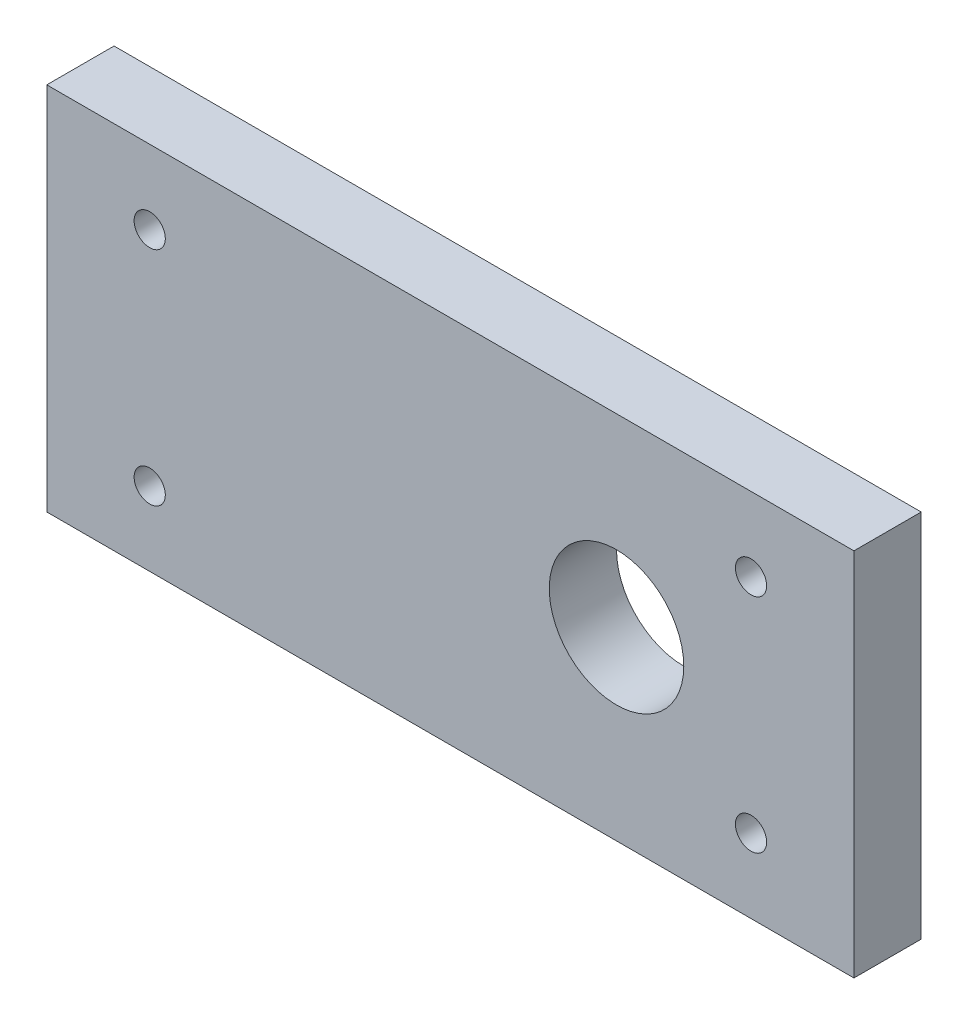
ISO-10303-21;
HEADER;
FILE_DESCRIPTION(('STEP AP214'),'2;1');
FILE_NAME('part.step','',(''),(''),'','','');
FILE_SCHEMA(('AUTOMOTIVE_DESIGN { 1 0 10303 214 1 1 1 1 }'));
ENDSEC;
DATA;
#1=APPLICATION_CONTEXT('core data for automotive mechanical design processes');
#2=APPLICATION_PROTOCOL_DEFINITION('international standard','automotive_design',2000,#1);
#3=PRODUCT_CONTEXT('',#1,'mechanical');
#4=PRODUCT('Part','Part','',(#3));
#5=PRODUCT_RELATED_PRODUCT_CATEGORY('part','',(#4));
#6=PRODUCT_DEFINITION_FORMATION('','',#4);
#7=PRODUCT_DEFINITION_CONTEXT('part definition',#1,'design');
#8=PRODUCT_DEFINITION('design','',#6,#7);
#9=PRODUCT_DEFINITION_SHAPE('','',#8);
#10=(LENGTH_UNIT() NAMED_UNIT(*) SI_UNIT(.MILLI.,.METRE.));
#11=(NAMED_UNIT(*) PLANE_ANGLE_UNIT() SI_UNIT($,.RADIAN.));
#12=(NAMED_UNIT(*) SI_UNIT($,.STERADIAN.) SOLID_ANGLE_UNIT());
#13=UNCERTAINTY_MEASURE_WITH_UNIT(LENGTH_MEASURE(1.E-05),#10,'distance_accuracy_value','');
#14=(GEOMETRIC_REPRESENTATION_CONTEXT(3) GLOBAL_UNCERTAINTY_ASSIGNED_CONTEXT((#13)) GLOBAL_UNIT_ASSIGNED_CONTEXT((#10,
#11,#12)) REPRESENTATION_CONTEXT('',''));
#15=CARTESIAN_POINT('',(0.,0.,0.));
#16=DIRECTION('',(0.,0.,1.));
#17=DIRECTION('',(1.,0.,0.));
#18=AXIS2_PLACEMENT_3D('',#15,#16,#17);
#19=CARTESIAN_POINT('',(0.,0.,6.35));
#20=DIRECTION('',(0.,0.,-1.));
#21=DIRECTION('',(-1.,0.,0.));
#22=AXIS2_PLACEMENT_3D('',#19,#20,#21);
#23=PLANE('',#22);
#24=CARTESIAN_POINT('',(15.6845,0.,6.35));
#25=DIRECTION('',(0.,0.,1.));
#26=DIRECTION('',(1.,0.,0.));
#27=AXIS2_PLACEMENT_3D('',#24,#25,#26);
#28=CIRCLE('',#27,6.35);
#29=CARTESIAN_POINT('',(22.0345,0.,6.35));
#30=VERTEX_POINT('',#29);
#31=EDGE_CURVE('E134',#30,#30,#28,.T.);
#32=ORIENTED_EDGE('',*,*,#31,.F.);
#33=EDGE_LOOP('',(#32));
#34=FACE_BOUND('',#33,.T.);
#35=CARTESIAN_POINT('',(-28.3845,10.4775,6.35));
#36=DIRECTION('',(0.,0.,1.));
#37=DIRECTION('',(1.,0.,0.));
#38=AXIS2_PLACEMENT_3D('',#35,#36,#37);
#39=CIRCLE('',#38,1.4732);
#40=CARTESIAN_POINT('',(-26.9113,10.4775,6.35));
#41=VERTEX_POINT('',#40);
#42=EDGE_CURVE('E128',#41,#41,#39,.T.);
#43=ORIENTED_EDGE('',*,*,#42,.F.);
#44=EDGE_LOOP('',(#43));
#45=FACE_BOUND('',#44,.T.);
#46=CARTESIAN_POINT('',(-28.3845,-10.4775,6.35));
#47=DIRECTION('',(0.,0.,1.));
#48=DIRECTION('',(1.,0.,0.));
#49=AXIS2_PLACEMENT_3D('',#46,#47,#48);
#50=CIRCLE('',#49,1.4732);
#51=CARTESIAN_POINT('',(-26.9113,-10.4775,6.35));
#52=VERTEX_POINT('',#51);
#53=EDGE_CURVE('E122',#52,#52,#50,.T.);
#54=ORIENTED_EDGE('',*,*,#53,.F.);
#55=EDGE_LOOP('',(#54));
#56=FACE_BOUND('',#55,.T.);
#57=CARTESIAN_POINT('',(28.3845,10.4775,6.35));
#58=DIRECTION('',(0.,0.,1.));
#59=DIRECTION('',(1.,0.,0.));
#60=AXIS2_PLACEMENT_3D('',#57,#58,#59);
#61=CIRCLE('',#60,1.4732);
#62=CARTESIAN_POINT('',(29.8577,10.4775,6.35));
#63=VERTEX_POINT('',#62);
#64=EDGE_CURVE('E100',#63,#63,#61,.T.);
#65=ORIENTED_EDGE('',*,*,#64,.F.);
#66=EDGE_LOOP('',(#65));
#67=FACE_BOUND('',#66,.T.);
#68=DIRECTION('',(0.,1.,0.));
#69=VECTOR('',#68,1.);
#70=CARTESIAN_POINT('',(38.1,-17.4625,6.35));
#71=LINE('',#70,#69);
#72=CARTESIAN_POINT('',(38.1,-17.4625,6.35));
#73=VERTEX_POINT('',#72);
#74=CARTESIAN_POINT('',(38.1,17.4625,6.35));
#75=VERTEX_POINT('',#74);
#76=EDGE_CURVE('E85',#73,#75,#71,.T.);
#77=ORIENTED_EDGE('',*,*,#76,.T.);
#78=DIRECTION('',(-1.,0.,0.));
#79=VECTOR('',#78,1.);
#80=CARTESIAN_POINT('',(-38.1,17.4625,6.35));
#81=LINE('',#80,#79);
#82=CARTESIAN_POINT('',(-38.1,17.4625,6.35));
#83=VERTEX_POINT('',#82);
#84=EDGE_CURVE('E80',#75,#83,#81,.T.);
#85=ORIENTED_EDGE('',*,*,#84,.T.);
#86=DIRECTION('',(0.,-1.,0.));
#87=VECTOR('',#86,1.);
#88=CARTESIAN_POINT('',(-38.1,-17.4625,6.35));
#89=LINE('',#88,#87);
#90=CARTESIAN_POINT('',(-38.1,-17.4625,6.35));
#91=VERTEX_POINT('',#90);
#92=EDGE_CURVE('E83',#83,#91,#89,.T.);
#93=ORIENTED_EDGE('',*,*,#92,.T.);
#94=DIRECTION('',(1.,0.,0.));
#95=VECTOR('',#94,1.);
#96=CARTESIAN_POINT('',(-38.1,-17.4625,6.35));
#97=LINE('',#96,#95);
#98=EDGE_CURVE('E50',#91,#73,#97,.T.);
#99=ORIENTED_EDGE('',*,*,#98,.T.);
#100=EDGE_LOOP('',(#77,#85,#93,#99));
#101=FACE_BOUND('',#100,.T.);
#102=CARTESIAN_POINT('',(28.3845,-10.4775,6.35));
#103=DIRECTION('',(0.,0.,1.));
#104=DIRECTION('',(1.,0.,0.));
#105=AXIS2_PLACEMENT_3D('',#102,#103,#104);
#106=CIRCLE('',#105,1.4732);
#107=CARTESIAN_POINT('',(29.8577,-10.4775,6.35));
#108=VERTEX_POINT('',#107);
#109=EDGE_CURVE('E116',#108,#108,#106,.T.);
#110=ORIENTED_EDGE('',*,*,#109,.F.);
#111=EDGE_LOOP('',(#110));
#112=FACE_BOUND('',#111,.T.);
#113=ADVANCED_FACE('F33',(#34,#45,#56,#67,#101,#112),#23,.F.);
#114=CARTESIAN_POINT('',(38.1,-17.4625,6.35));
#115=DIRECTION('',(-1.,0.,0.));
#116=DIRECTION('',(0.,0.,1.));
#117=AXIS2_PLACEMENT_3D('',#114,#115,#116);
#118=PLANE('',#117);
#119=DIRECTION('',(0.,1.,0.));
#120=VECTOR('',#119,1.);
#121=CARTESIAN_POINT('',(38.1,-17.4625,0.));
#122=LINE('',#121,#120);
#123=CARTESIAN_POINT('',(38.1,-17.4625,0.));
#124=VERTEX_POINT('',#123);
#125=CARTESIAN_POINT('',(38.1,17.4625,0.));
#126=VERTEX_POINT('',#125);
#127=EDGE_CURVE('E97',#124,#126,#122,.T.);
#128=ORIENTED_EDGE('',*,*,#127,.T.);
#129=DIRECTION('',(0.,0.,-1.));
#130=VECTOR('',#129,1.);
#131=CARTESIAN_POINT('',(38.1,17.4625,6.35));
#132=LINE('',#131,#130);
#133=EDGE_CURVE('E11',#75,#126,#132,.T.);
#134=ORIENTED_EDGE('',*,*,#133,.F.);
#135=ORIENTED_EDGE('',*,*,#76,.F.);
#136=DIRECTION('',(0.,0.,-1.));
#137=VECTOR('',#136,1.);
#138=CARTESIAN_POINT('',(38.1,-17.4625,6.35));
#139=LINE('',#138,#137);
#140=EDGE_CURVE('E93',#73,#124,#139,.T.);
#141=ORIENTED_EDGE('',*,*,#140,.T.);
#142=EDGE_LOOP('',(#128,#134,#135,#141));
#143=FACE_BOUND('',#142,.T.);
#144=ADVANCED_FACE('F35',(#143),#118,.F.);
#145=CARTESIAN_POINT('',(-38.1,17.4625,6.35));
#146=DIRECTION('',(0.,-1.,0.));
#147=DIRECTION('',(0.,0.,-1.));
#148=AXIS2_PLACEMENT_3D('',#145,#146,#147);
#149=PLANE('',#148);
#150=DIRECTION('',(-1.,0.,0.));
#151=VECTOR('',#150,1.);
#152=CARTESIAN_POINT('',(-38.1,17.4625,0.));
#153=LINE('',#152,#151);
#154=CARTESIAN_POINT('',(-38.1,17.4625,0.));
#155=VERTEX_POINT('',#154);
#156=EDGE_CURVE('E89',#126,#155,#153,.T.);
#157=ORIENTED_EDGE('',*,*,#156,.T.);
#158=DIRECTION('',(0.,0.,-1.));
#159=VECTOR('',#158,1.);
#160=CARTESIAN_POINT('',(-38.1,17.4625,6.35));
#161=LINE('',#160,#159);
#162=EDGE_CURVE('E42',#83,#155,#161,.T.);
#163=ORIENTED_EDGE('',*,*,#162,.F.);
#164=ORIENTED_EDGE('',*,*,#84,.F.);
#165=ORIENTED_EDGE('',*,*,#133,.T.);
#166=EDGE_LOOP('',(#157,#163,#164,#165));
#167=FACE_BOUND('',#166,.T.);
#168=ADVANCED_FACE('F88',(#167),#149,.F.);
#169=CARTESIAN_POINT('',(-38.1,-17.4625,6.35));
#170=DIRECTION('',(1.,0.,0.));
#171=DIRECTION('',(0.,0.,-1.));
#172=AXIS2_PLACEMENT_3D('',#169,#170,#171);
#173=PLANE('',#172);
#174=DIRECTION('',(0.,-1.,0.));
#175=VECTOR('',#174,1.);
#176=CARTESIAN_POINT('',(-38.1,-17.4625,0.));
#177=LINE('',#176,#175);
#178=CARTESIAN_POINT('',(-38.1,-17.4625,0.));
#179=VERTEX_POINT('',#178);
#180=EDGE_CURVE('E67',#155,#179,#177,.T.);
#181=ORIENTED_EDGE('',*,*,#180,.T.);
#182=DIRECTION('',(0.,0.,-1.));
#183=VECTOR('',#182,1.);
#184=CARTESIAN_POINT('',(-38.1,-17.4625,6.35));
#185=LINE('',#184,#183);
#186=EDGE_CURVE('E90',#91,#179,#185,.T.);
#187=ORIENTED_EDGE('',*,*,#186,.F.);
#188=ORIENTED_EDGE('',*,*,#92,.F.);
#189=ORIENTED_EDGE('',*,*,#162,.T.);
#190=EDGE_LOOP('',(#181,#187,#188,#189));
#191=FACE_BOUND('',#190,.T.);
#192=ADVANCED_FACE('F91',(#191),#173,.F.);
#193=CARTESIAN_POINT('',(-38.1,-17.4625,6.35));
#194=DIRECTION('',(0.,1.,0.));
#195=DIRECTION('',(0.,0.,1.));
#196=AXIS2_PLACEMENT_3D('',#193,#194,#195);
#197=PLANE('',#196);
#198=DIRECTION('',(1.,0.,0.));
#199=VECTOR('',#198,1.);
#200=CARTESIAN_POINT('',(-38.1,-17.4625,0.));
#201=LINE('',#200,#199);
#202=EDGE_CURVE('E73',#179,#124,#201,.T.);
#203=ORIENTED_EDGE('',*,*,#202,.T.);
#204=ORIENTED_EDGE('',*,*,#140,.F.);
#205=ORIENTED_EDGE('',*,*,#98,.F.);
#206=ORIENTED_EDGE('',*,*,#186,.T.);
#207=EDGE_LOOP('',(#203,#204,#205,#206));
#208=FACE_BOUND('',#207,.T.);
#209=ADVANCED_FACE('F105',(#208),#197,.F.);
#210=CARTESIAN_POINT('',(0.,0.,0.));
#211=DIRECTION('',(0.,0.,-1.));
#212=DIRECTION('',(-1.,0.,0.));
#213=AXIS2_PLACEMENT_3D('',#210,#211,#212);
#214=PLANE('',#213);
#215=CARTESIAN_POINT('',(15.6845,0.,0.));
#216=DIRECTION('',(0.,0.,-1.));
#217=DIRECTION('',(-1.,0.,0.));
#218=AXIS2_PLACEMENT_3D('',#215,#216,#217);
#219=CIRCLE('',#218,6.35);
#220=CARTESIAN_POINT('',(9.3345,0.,0.));
#221=VERTEX_POINT('',#220);
#222=EDGE_CURVE('E135',#221,#221,#219,.F.);
#223=ORIENTED_EDGE('',*,*,#222,.T.);
#224=EDGE_LOOP('',(#223));
#225=FACE_BOUND('',#224,.T.);
#226=CARTESIAN_POINT('',(-28.3845,10.4775,0.));
#227=DIRECTION('',(0.,0.,1.));
#228=DIRECTION('',(1.,0.,0.));
#229=AXIS2_PLACEMENT_3D('',#226,#227,#228);
#230=CIRCLE('',#229,1.4732);
#231=CARTESIAN_POINT('',(-26.9113,10.4775,0.));
#232=VERTEX_POINT('',#231);
#233=EDGE_CURVE('E131',#232,#232,#230,.T.);
#234=ORIENTED_EDGE('',*,*,#233,.T.);
#235=EDGE_LOOP('',(#234));
#236=FACE_BOUND('',#235,.T.);
#237=CARTESIAN_POINT('',(-28.3845,-10.4775,0.));
#238=DIRECTION('',(0.,0.,1.));
#239=DIRECTION('',(1.,0.,0.));
#240=AXIS2_PLACEMENT_3D('',#237,#238,#239);
#241=CIRCLE('',#240,1.4732);
#242=CARTESIAN_POINT('',(-26.9113,-10.4775,0.));
#243=VERTEX_POINT('',#242);
#244=EDGE_CURVE('E125',#243,#243,#241,.T.);
#245=ORIENTED_EDGE('',*,*,#244,.T.);
#246=EDGE_LOOP('',(#245));
#247=FACE_BOUND('',#246,.T.);
#248=CARTESIAN_POINT('',(28.3845,-10.4775,0.));
#249=DIRECTION('',(0.,0.,1.));
#250=DIRECTION('',(1.,0.,0.));
#251=AXIS2_PLACEMENT_3D('',#248,#249,#250);
#252=CIRCLE('',#251,1.4732);
#253=CARTESIAN_POINT('',(29.8577,-10.4775,0.));
#254=VERTEX_POINT('',#253);
#255=EDGE_CURVE('E119',#254,#254,#252,.T.);
#256=ORIENTED_EDGE('',*,*,#255,.T.);
#257=EDGE_LOOP('',(#256));
#258=FACE_BOUND('',#257,.T.);
#259=CARTESIAN_POINT('',(28.3845,10.4775,0.));
#260=DIRECTION('',(0.,0.,1.));
#261=DIRECTION('',(1.,0.,0.));
#262=AXIS2_PLACEMENT_3D('',#259,#260,#261);
#263=CIRCLE('',#262,1.4732);
#264=CARTESIAN_POINT('',(29.8577,10.4775,0.));
#265=VERTEX_POINT('',#264);
#266=EDGE_CURVE('E113',#265,#265,#263,.T.);
#267=ORIENTED_EDGE('',*,*,#266,.T.);
#268=EDGE_LOOP('',(#267));
#269=FACE_BOUND('',#268,.T.);
#270=ORIENTED_EDGE('',*,*,#127,.F.);
#271=ORIENTED_EDGE('',*,*,#202,.F.);
#272=ORIENTED_EDGE('',*,*,#180,.F.);
#273=ORIENTED_EDGE('',*,*,#156,.F.);
#274=EDGE_LOOP('',(#270,#271,#272,#273));
#275=FACE_BOUND('',#274,.T.);
#276=ADVANCED_FACE('F108',(#225,#236,#247,#258,#269,#275),#214,.T.);
#277=CARTESIAN_POINT('',(28.3845,10.4775,6.35));
#278=DIRECTION('',(0.,0.,1.));
#279=DIRECTION('',(1.,0.,0.));
#280=AXIS2_PLACEMENT_3D('',#277,#278,#279);
#281=CYLINDRICAL_SURFACE('',#280,1.4732);
#282=ORIENTED_EDGE('',*,*,#266,.F.);
#283=EDGE_LOOP('',(#282));
#284=FACE_BOUND('',#283,.T.);
#285=ORIENTED_EDGE('',*,*,#64,.T.);
#286=EDGE_LOOP('',(#285));
#287=FACE_BOUND('',#286,.T.);
#288=ADVANCED_FACE('F152',(#284,#287),#281,.F.);
#289=CARTESIAN_POINT('',(28.3845,-10.4775,6.35));
#290=DIRECTION('',(0.,0.,1.));
#291=DIRECTION('',(1.,0.,0.));
#292=AXIS2_PLACEMENT_3D('',#289,#290,#291);
#293=CYLINDRICAL_SURFACE('',#292,1.4732);
#294=ORIENTED_EDGE('',*,*,#255,.F.);
#295=EDGE_LOOP('',(#294));
#296=FACE_BOUND('',#295,.T.);
#297=ORIENTED_EDGE('',*,*,#109,.T.);
#298=EDGE_LOOP('',(#297));
#299=FACE_BOUND('',#298,.T.);
#300=ADVANCED_FACE('F154',(#296,#299),#293,.F.);
#301=CARTESIAN_POINT('',(-28.3845,-10.4775,6.35));
#302=DIRECTION('',(0.,0.,1.));
#303=DIRECTION('',(1.,0.,0.));
#304=AXIS2_PLACEMENT_3D('',#301,#302,#303);
#305=CYLINDRICAL_SURFACE('',#304,1.4732);
#306=ORIENTED_EDGE('',*,*,#244,.F.);
#307=EDGE_LOOP('',(#306));
#308=FACE_BOUND('',#307,.T.);
#309=ORIENTED_EDGE('',*,*,#53,.T.);
#310=EDGE_LOOP('',(#309));
#311=FACE_BOUND('',#310,.T.);
#312=ADVANCED_FACE('F161',(#308,#311),#305,.F.);
#313=CARTESIAN_POINT('',(-28.3845,10.4775,6.35));
#314=DIRECTION('',(0.,0.,1.));
#315=DIRECTION('',(1.,0.,0.));
#316=AXIS2_PLACEMENT_3D('',#313,#314,#315);
#317=CYLINDRICAL_SURFACE('',#316,1.4732);
#318=ORIENTED_EDGE('',*,*,#233,.F.);
#319=EDGE_LOOP('',(#318));
#320=FACE_BOUND('',#319,.T.);
#321=ORIENTED_EDGE('',*,*,#42,.T.);
#322=EDGE_LOOP('',(#321));
#323=FACE_BOUND('',#322,.T.);
#324=ADVANCED_FACE('F190',(#320,#323),#317,.F.);
#325=CARTESIAN_POINT('',(15.6845,0.,-0.00100000000000013));
#326=DIRECTION('',(0.,0.,1.));
#327=DIRECTION('',(1.,0.,0.));
#328=AXIS2_PLACEMENT_3D('',#325,#326,#327);
#329=CYLINDRICAL_SURFACE('',#328,6.35);
#330=ORIENTED_EDGE('',*,*,#222,.F.);
#331=EDGE_LOOP('',(#330));
#332=FACE_BOUND('',#331,.T.);
#333=ORIENTED_EDGE('',*,*,#31,.T.);
#334=EDGE_LOOP('',(#333));
#335=FACE_BOUND('',#334,.T.);
#336=ADVANCED_FACE('F141',(#332,#335),#329,.F.);
#337=CLOSED_SHELL('',(#113,#144,#168,#192,#209,#276,#288,#300,#312,#324,#336));
#338=MANIFOLD_SOLID_BREP('B2',#337);
#339=ADVANCED_BREP_SHAPE_REPRESENTATION('',(#18,#338),#14);
#340=SHAPE_DEFINITION_REPRESENTATION(#9,#339);
ENDSEC;
END-ISO-10303-21;
